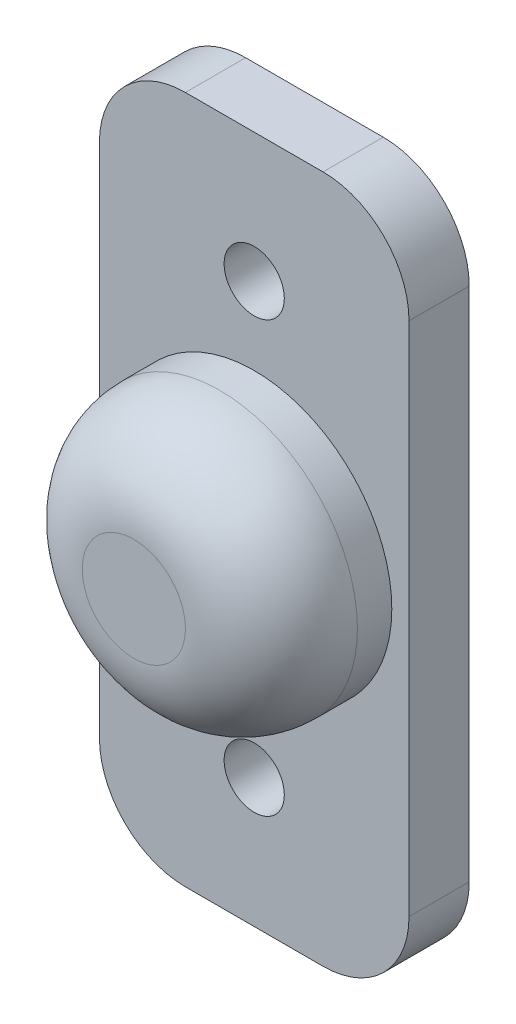
ISO-10303-21;
HEADER;
FILE_DESCRIPTION(('STEP AP214'),'2;1');
FILE_NAME('part.step','',(''),(''),'','','');
FILE_SCHEMA(('AUTOMOTIVE_DESIGN { 1 0 10303 214 1 1 1 1 }'));
ENDSEC;
DATA;
#1=APPLICATION_CONTEXT('core data for automotive mechanical design processes');
#2=APPLICATION_PROTOCOL_DEFINITION('international standard','automotive_design',2000,#1);
#3=PRODUCT_CONTEXT('',#1,'mechanical');
#4=PRODUCT('Part','Part','',(#3));
#5=PRODUCT_RELATED_PRODUCT_CATEGORY('part','',(#4));
#6=PRODUCT_DEFINITION_FORMATION('','',#4);
#7=PRODUCT_DEFINITION_CONTEXT('part definition',#1,'design');
#8=PRODUCT_DEFINITION('design','',#6,#7);
#9=PRODUCT_DEFINITION_SHAPE('','',#8);
#10=(LENGTH_UNIT() NAMED_UNIT(*) SI_UNIT(.MILLI.,.METRE.));
#11=(NAMED_UNIT(*) PLANE_ANGLE_UNIT() SI_UNIT($,.RADIAN.));
#12=(NAMED_UNIT(*) SI_UNIT($,.STERADIAN.) SOLID_ANGLE_UNIT());
#13=UNCERTAINTY_MEASURE_WITH_UNIT(LENGTH_MEASURE(1.E-05),#10,'distance_accuracy_value','');
#14=(GEOMETRIC_REPRESENTATION_CONTEXT(3) GLOBAL_UNCERTAINTY_ASSIGNED_CONTEXT((#13)) GLOBAL_UNIT_ASSIGNED_CONTEXT((#10,
#11,#12)) REPRESENTATION_CONTEXT('',''));
#15=CARTESIAN_POINT('',(0.,0.,0.));
#16=DIRECTION('',(0.,0.,1.));
#17=DIRECTION('',(1.,0.,0.));
#18=AXIS2_PLACEMENT_3D('',#15,#16,#17);
#19=CARTESIAN_POINT('',(0.,0.,3.5));
#20=DIRECTION('',(0.,0.,1.));
#21=DIRECTION('',(1.,0.,0.));
#22=AXIS2_PLACEMENT_3D('',#19,#20,#21);
#23=PLANE('',#22);
#24=CARTESIAN_POINT('',(-6.97029165718189,-3.68587589894697,3.5));
#25=DIRECTION('',(0.,0.,1.));
#26=DIRECTION('',(1.,0.,0.));
#27=AXIS2_PLACEMENT_3D('',#24,#25,#26);
#28=CIRCLE('',#27,1.75);
#29=CARTESIAN_POINT('',(-5.22029165718189,-3.68587589894697,3.5));
#30=VERTEX_POINT('',#29);
#31=EDGE_CURVE('E190',#30,#30,#28,.T.);
#32=ORIENTED_EDGE('',*,*,#31,.F.);
#33=EDGE_LOOP('',(#32));
#34=FACE_BOUND('',#33,.T.);
#35=DIRECTION('',(1.,0.,0.));
#36=VECTOR('',#35,1.);
#37=CARTESIAN_POINT('',(-15.9702916571819,-11.185875898947,3.5));
#38=LINE('',#37,#36);
#39=CARTESIAN_POINT('',(-10.9702916571819,-11.185875898947,3.5));
#40=VERTEX_POINT('',#39);
#41=CARTESIAN_POINT('',(-2.97029165718189,-11.185875898947,3.5));
#42=VERTEX_POINT('',#41);
#43=EDGE_CURVE('E176',#40,#42,#38,.T.);
#44=ORIENTED_EDGE('',*,*,#43,.T.);
#45=CARTESIAN_POINT('',(-2.97029165718189,-6.18587589894697,3.5));
#46=DIRECTION('',(0.,0.,1.));
#47=DIRECTION('',(1.,0.,0.));
#48=AXIS2_PLACEMENT_3D('',#45,#46,#47);
#49=CIRCLE('',#48,5.);
#50=CARTESIAN_POINT('',(2.02970834281811,-6.18587589894697,3.5));
#51=VERTEX_POINT('',#50);
#52=EDGE_CURVE('E154',#42,#51,#49,.T.);
#53=ORIENTED_EDGE('',*,*,#52,.T.);
#54=DIRECTION('',(0.,1.,0.));
#55=VECTOR('',#54,1.);
#56=CARTESIAN_POINT('',(2.02970834281811,28.814124101053,3.5));
#57=LINE('',#56,#55);
#58=CARTESIAN_POINT('',(2.02970834281811,23.814124101053,3.5));
#59=VERTEX_POINT('',#58);
#60=EDGE_CURVE('E118',#51,#59,#57,.T.);
#61=ORIENTED_EDGE('',*,*,#60,.T.);
#62=CARTESIAN_POINT('',(-2.97029165718189,23.814124101053,3.5));
#63=DIRECTION('',(0.,0.,1.));
#64=DIRECTION('',(1.,0.,0.));
#65=AXIS2_PLACEMENT_3D('',#62,#63,#64);
#66=CIRCLE('',#65,5.);
#67=CARTESIAN_POINT('',(-2.97029165718189,28.814124101053,3.5));
#68=VERTEX_POINT('',#67);
#69=EDGE_CURVE('E54',#59,#68,#66,.T.);
#70=ORIENTED_EDGE('',*,*,#69,.T.);
#71=DIRECTION('',(-1.,0.,0.));
#72=VECTOR('',#71,1.);
#73=CARTESIAN_POINT('',(-15.9702916571819,28.814124101053,3.5));
#74=LINE('',#73,#72);
#75=CARTESIAN_POINT('',(-10.9702916571819,28.814124101053,3.5));
#76=VERTEX_POINT('',#75);
#77=EDGE_CURVE('E138',#68,#76,#74,.T.);
#78=ORIENTED_EDGE('',*,*,#77,.T.);
#79=CARTESIAN_POINT('',(-10.9702916571819,23.814124101053,3.5));
#80=DIRECTION('',(0.,0.,1.));
#81=DIRECTION('',(1.,0.,0.));
#82=AXIS2_PLACEMENT_3D('',#79,#80,#81);
#83=CIRCLE('',#82,5.);
#84=CARTESIAN_POINT('',(-15.9702916571819,23.814124101053,3.5));
#85=VERTEX_POINT('',#84);
#86=EDGE_CURVE('E150',#76,#85,#83,.T.);
#87=ORIENTED_EDGE('',*,*,#86,.T.);
#88=DIRECTION('',(0.,-1.,0.));
#89=VECTOR('',#88,1.);
#90=CARTESIAN_POINT('',(-15.9702916571819,28.814124101053,3.5));
#91=LINE('',#90,#89);
#92=CARTESIAN_POINT('',(-15.9702916571819,-6.18587589894697,3.5));
#93=VERTEX_POINT('',#92);
#94=EDGE_CURVE('E128',#85,#93,#91,.T.);
#95=ORIENTED_EDGE('',*,*,#94,.T.);
#96=CARTESIAN_POINT('',(-10.9702916571819,-6.18587589894698,3.5));
#97=DIRECTION('',(0.,0.,1.));
#98=DIRECTION('',(1.,0.,0.));
#99=AXIS2_PLACEMENT_3D('',#96,#97,#98);
#100=CIRCLE('',#99,5.);
#101=EDGE_CURVE('E152',#93,#40,#100,.T.);
#102=ORIENTED_EDGE('',*,*,#101,.T.);
#103=EDGE_LOOP('',(#44,#53,#61,#70,#78,#87,#95,#102));
#104=FACE_BOUND('',#103,.T.);
#105=CARTESIAN_POINT('',(-6.97029165718189,21.314124101053,3.5));
#106=DIRECTION('',(0.,0.,1.));
#107=DIRECTION('',(1.,0.,0.));
#108=AXIS2_PLACEMENT_3D('',#105,#106,#107);
#109=CIRCLE('',#108,1.75);
#110=CARTESIAN_POINT('',(-5.22029165718189,21.314124101053,3.5));
#111=VERTEX_POINT('',#110);
#112=EDGE_CURVE('E185',#111,#111,#109,.T.);
#113=ORIENTED_EDGE('',*,*,#112,.F.);
#114=EDGE_LOOP('',(#113));
#115=FACE_BOUND('',#114,.T.);
#116=CARTESIAN_POINT('',(-6.9702916571819,8.81412410105303,3.5));
#117=DIRECTION('',(0.,0.,1.));
#118=DIRECTION('',(1.,0.,0.));
#119=AXIS2_PLACEMENT_3D('',#116,#117,#118);
#120=CIRCLE('',#119,8.);
#121=CARTESIAN_POINT('',(1.02970834281811,8.81412410105303,3.5));
#122=VERTEX_POINT('',#121);
#123=EDGE_CURVE('E195',#122,#122,#120,.T.);
#124=ORIENTED_EDGE('',*,*,#123,.F.);
#125=EDGE_LOOP('',(#124));
#126=FACE_BOUND('',#125,.T.);
#127=ADVANCED_FACE('F34',(#34,#104,#115,#126),#23,.T.);
#128=CARTESIAN_POINT('',(0.,0.,0.));
#129=DIRECTION('',(0.,0.,1.));
#130=DIRECTION('',(1.,0.,0.));
#131=AXIS2_PLACEMENT_3D('',#128,#129,#130);
#132=PLANE('',#131);
#133=CARTESIAN_POINT('',(-6.9702916571819,8.81412410105303,0.));
#134=DIRECTION('',(0.,0.,-1.));
#135=DIRECTION('',(-1.,0.,0.));
#136=AXIS2_PLACEMENT_3D('',#133,#134,#135);
#137=CIRCLE('',#136,5.);
#138=CARTESIAN_POINT('',(-11.9702916571819,8.81412410105303,0.));
#139=VERTEX_POINT('',#138);
#140=EDGE_CURVE('E203',#139,#139,#137,.T.);
#141=ORIENTED_EDGE('',*,*,#140,.F.);
#142=EDGE_LOOP('',(#141));
#143=FACE_BOUND('',#142,.T.);
#144=CARTESIAN_POINT('',(-6.97029165718189,21.314124101053,0.));
#145=DIRECTION('',(0.,0.,1.));
#146=DIRECTION('',(1.,0.,0.));
#147=AXIS2_PLACEMENT_3D('',#144,#145,#146);
#148=CIRCLE('',#147,1.75);
#149=CARTESIAN_POINT('',(-5.22029165718189,21.314124101053,0.));
#150=VERTEX_POINT('',#149);
#151=EDGE_CURVE('E181',#150,#150,#148,.T.);
#152=ORIENTED_EDGE('',*,*,#151,.T.);
#153=EDGE_LOOP('',(#152));
#154=FACE_BOUND('',#153,.T.);
#155=DIRECTION('',(0.,1.,0.));
#156=VECTOR('',#155,1.);
#157=CARTESIAN_POINT('',(2.02970834281811,28.814124101053,0.));
#158=LINE('',#157,#156);
#159=CARTESIAN_POINT('',(2.02970834281811,-6.18587589894697,0.));
#160=VERTEX_POINT('',#159);
#161=CARTESIAN_POINT('',(2.02970834281811,23.814124101053,0.));
#162=VERTEX_POINT('',#161);
#163=EDGE_CURVE('E116',#160,#162,#158,.T.);
#164=ORIENTED_EDGE('',*,*,#163,.F.);
#165=CARTESIAN_POINT('',(-2.97029165718189,-6.18587589894697,0.));
#166=DIRECTION('',(0.,0.,1.));
#167=DIRECTION('',(1.,0.,0.));
#168=AXIS2_PLACEMENT_3D('',#165,#166,#167);
#169=CIRCLE('',#168,5.);
#170=CARTESIAN_POINT('',(-2.97029165718189,-11.185875898947,0.));
#171=VERTEX_POINT('',#170);
#172=EDGE_CURVE('E99',#160,#171,#169,.F.);
#173=ORIENTED_EDGE('',*,*,#172,.T.);
#174=DIRECTION('',(1.,0.,0.));
#175=VECTOR('',#174,1.);
#176=CARTESIAN_POINT('',(-15.9702916571819,-11.185875898947,0.));
#177=LINE('',#176,#175);
#178=CARTESIAN_POINT('',(-10.9702916571819,-11.185875898947,0.));
#179=VERTEX_POINT('',#178);
#180=EDGE_CURVE('E126',#179,#171,#177,.T.);
#181=ORIENTED_EDGE('',*,*,#180,.F.);
#182=CARTESIAN_POINT('',(-10.9702916571819,-6.18587589894698,0.));
#183=DIRECTION('',(0.,0.,1.));
#184=DIRECTION('',(1.,0.,0.));
#185=AXIS2_PLACEMENT_3D('',#182,#183,#184);
#186=CIRCLE('',#185,5.);
#187=CARTESIAN_POINT('',(-15.9702916571819,-6.18587589894697,0.));
#188=VERTEX_POINT('',#187);
#189=EDGE_CURVE('E110',#179,#188,#186,.F.);
#190=ORIENTED_EDGE('',*,*,#189,.T.);
#191=DIRECTION('',(0.,-1.,0.));
#192=VECTOR('',#191,1.);
#193=CARTESIAN_POINT('',(-15.9702916571819,28.814124101053,0.));
#194=LINE('',#193,#192);
#195=CARTESIAN_POINT('',(-15.9702916571819,23.814124101053,0.));
#196=VERTEX_POINT('',#195);
#197=EDGE_CURVE('E130',#196,#188,#194,.T.);
#198=ORIENTED_EDGE('',*,*,#197,.F.);
#199=CARTESIAN_POINT('',(-10.9702916571819,23.814124101053,0.));
#200=DIRECTION('',(0.,0.,1.));
#201=DIRECTION('',(1.,0.,0.));
#202=AXIS2_PLACEMENT_3D('',#199,#200,#201);
#203=CIRCLE('',#202,5.);
#204=CARTESIAN_POINT('',(-10.9702916571819,28.814124101053,0.));
#205=VERTEX_POINT('',#204);
#206=EDGE_CURVE('E143',#196,#205,#203,.F.);
#207=ORIENTED_EDGE('',*,*,#206,.T.);
#208=DIRECTION('',(-1.,0.,0.));
#209=VECTOR('',#208,1.);
#210=CARTESIAN_POINT('',(-15.9702916571819,28.814124101053,0.));
#211=LINE('',#210,#209);
#212=CARTESIAN_POINT('',(-2.97029165718189,28.814124101053,0.));
#213=VERTEX_POINT('',#212);
#214=EDGE_CURVE('E125',#213,#205,#211,.T.);
#215=ORIENTED_EDGE('',*,*,#214,.F.);
#216=CARTESIAN_POINT('',(-2.97029165718189,23.814124101053,0.));
#217=DIRECTION('',(0.,0.,1.));
#218=DIRECTION('',(1.,0.,0.));
#219=AXIS2_PLACEMENT_3D('',#216,#217,#218);
#220=CIRCLE('',#219,5.);
#221=EDGE_CURVE('E119',#213,#162,#220,.F.);
#222=ORIENTED_EDGE('',*,*,#221,.T.);
#223=EDGE_LOOP('',(#164,#173,#181,#190,#198,#207,#215,#222));
#224=FACE_BOUND('',#223,.T.);
#225=CARTESIAN_POINT('',(-6.97029165718189,-3.68587589894697,0.));
#226=DIRECTION('',(0.,0.,1.));
#227=DIRECTION('',(1.,0.,0.));
#228=AXIS2_PLACEMENT_3D('',#225,#226,#227);
#229=CIRCLE('',#228,1.75);
#230=CARTESIAN_POINT('',(-5.22029165718189,-3.68587589894697,0.));
#231=VERTEX_POINT('',#230);
#232=EDGE_CURVE('E192',#231,#231,#229,.T.);
#233=ORIENTED_EDGE('',*,*,#232,.T.);
#234=EDGE_LOOP('',(#233));
#235=FACE_BOUND('',#234,.T.);
#236=ADVANCED_FACE('F122',(#143,#154,#224,#235),#132,.F.);
#237=CARTESIAN_POINT('',(-15.9702916571819,28.814124101053,3.5));
#238=DIRECTION('',(1.,0.,0.));
#239=DIRECTION('',(0.,1.,0.));
#240=AXIS2_PLACEMENT_3D('',#237,#238,#239);
#241=PLANE('',#240);
#242=ORIENTED_EDGE('',*,*,#197,.T.);
#243=DIRECTION('',(0.,0.,-1.));
#244=VECTOR('',#243,1.);
#245=CARTESIAN_POINT('',(-15.9702916571819,-6.18587589894697,3.5));
#246=LINE('',#245,#244);
#247=EDGE_CURVE('E159',#188,#93,#246,.F.);
#248=ORIENTED_EDGE('',*,*,#247,.T.);
#249=ORIENTED_EDGE('',*,*,#94,.F.);
#250=DIRECTION('',(0.,0.,-1.));
#251=VECTOR('',#250,1.);
#252=CARTESIAN_POINT('',(-15.9702916571819,23.814124101053,3.5));
#253=LINE('',#252,#251);
#254=EDGE_CURVE('E156',#85,#196,#253,.T.);
#255=ORIENTED_EDGE('',*,*,#254,.T.);
#256=EDGE_LOOP('',(#242,#248,#249,#255));
#257=FACE_BOUND('',#256,.T.);
#258=ADVANCED_FACE('F172',(#257),#241,.F.);
#259=CARTESIAN_POINT('',(-15.9702916571819,-11.185875898947,3.5));
#260=DIRECTION('',(0.,1.,0.));
#261=DIRECTION('',(-1.,0.,0.));
#262=AXIS2_PLACEMENT_3D('',#259,#260,#261);
#263=PLANE('',#262);
#264=ORIENTED_EDGE('',*,*,#180,.T.);
#265=DIRECTION('',(0.,0.,-1.));
#266=VECTOR('',#265,1.);
#267=CARTESIAN_POINT('',(-2.97029165718189,-11.185875898947,3.5));
#268=LINE('',#267,#266);
#269=EDGE_CURVE('E104',#171,#42,#268,.F.);
#270=ORIENTED_EDGE('',*,*,#269,.T.);
#271=ORIENTED_EDGE('',*,*,#43,.F.);
#272=DIRECTION('',(0.,0.,-1.));
#273=VECTOR('',#272,1.);
#274=CARTESIAN_POINT('',(-10.9702916571819,-11.185875898947,3.5));
#275=LINE('',#274,#273);
#276=EDGE_CURVE('E109',#40,#179,#275,.T.);
#277=ORIENTED_EDGE('',*,*,#276,.T.);
#278=EDGE_LOOP('',(#264,#270,#271,#277));
#279=FACE_BOUND('',#278,.T.);
#280=ADVANCED_FACE('F236',(#279),#263,.F.);
#281=CARTESIAN_POINT('',(2.02970834281811,28.814124101053,3.5));
#282=DIRECTION('',(-1.,0.,0.));
#283=DIRECTION('',(0.,-1.,0.));
#284=AXIS2_PLACEMENT_3D('',#281,#282,#283);
#285=PLANE('',#284);
#286=ORIENTED_EDGE('',*,*,#60,.F.);
#287=DIRECTION('',(0.,0.,-1.));
#288=VECTOR('',#287,1.);
#289=CARTESIAN_POINT('',(2.02970834281811,-6.18587589894697,3.5));
#290=LINE('',#289,#288);
#291=EDGE_CURVE('E103',#51,#160,#290,.T.);
#292=ORIENTED_EDGE('',*,*,#291,.T.);
#293=ORIENTED_EDGE('',*,*,#163,.T.);
#294=DIRECTION('',(0.,0.,-1.));
#295=VECTOR('',#294,1.);
#296=CARTESIAN_POINT('',(2.02970834281811,23.814124101053,3.5));
#297=LINE('',#296,#295);
#298=EDGE_CURVE('E120',#162,#59,#297,.F.);
#299=ORIENTED_EDGE('',*,*,#298,.T.);
#300=EDGE_LOOP('',(#286,#292,#293,#299));
#301=FACE_BOUND('',#300,.T.);
#302=ADVANCED_FACE('F115',(#301),#285,.F.);
#303=CARTESIAN_POINT('',(-15.9702916571819,28.814124101053,3.5));
#304=DIRECTION('',(0.,-1.,0.));
#305=DIRECTION('',(1.,0.,0.));
#306=AXIS2_PLACEMENT_3D('',#303,#304,#305);
#307=PLANE('',#306);
#308=ORIENTED_EDGE('',*,*,#214,.T.);
#309=DIRECTION('',(0.,0.,-1.));
#310=VECTOR('',#309,1.);
#311=CARTESIAN_POINT('',(-10.9702916571819,28.814124101053,3.5));
#312=LINE('',#311,#310);
#313=EDGE_CURVE('E12',#205,#76,#312,.F.);
#314=ORIENTED_EDGE('',*,*,#313,.T.);
#315=ORIENTED_EDGE('',*,*,#77,.F.);
#316=DIRECTION('',(0.,0.,-1.));
#317=VECTOR('',#316,1.);
#318=CARTESIAN_POINT('',(-2.97029165718189,28.814124101053,3.5));
#319=LINE('',#318,#317);
#320=EDGE_CURVE('E42',#68,#213,#319,.T.);
#321=ORIENTED_EDGE('',*,*,#320,.T.);
#322=EDGE_LOOP('',(#308,#314,#315,#321));
#323=FACE_BOUND('',#322,.T.);
#324=ADVANCED_FACE('F162',(#323),#307,.F.);
#325=CARTESIAN_POINT('',(-6.97029165718189,21.314124101053,3.5));
#326=DIRECTION('',(0.,0.,-1.));
#327=DIRECTION('',(-1.,0.,0.));
#328=AXIS2_PLACEMENT_3D('',#325,#326,#327);
#329=CYLINDRICAL_SURFACE('',#328,1.75);
#330=ORIENTED_EDGE('',*,*,#112,.T.);
#331=EDGE_LOOP('',(#330));
#332=FACE_BOUND('',#331,.T.);
#333=ORIENTED_EDGE('',*,*,#151,.F.);
#334=EDGE_LOOP('',(#333));
#335=FACE_BOUND('',#334,.T.);
#336=ADVANCED_FACE('F215',(#332,#335),#329,.F.);
#337=CARTESIAN_POINT('',(-6.97029165718189,-3.68587589894697,3.5));
#338=DIRECTION('',(0.,0.,-1.));
#339=DIRECTION('',(-1.,0.,0.));
#340=AXIS2_PLACEMENT_3D('',#337,#338,#339);
#341=CYLINDRICAL_SURFACE('',#340,1.75);
#342=ORIENTED_EDGE('',*,*,#31,.T.);
#343=EDGE_LOOP('',(#342));
#344=FACE_BOUND('',#343,.T.);
#345=ORIENTED_EDGE('',*,*,#232,.F.);
#346=EDGE_LOOP('',(#345));
#347=FACE_BOUND('',#346,.T.);
#348=ADVANCED_FACE('F217',(#344,#347),#341,.F.);
#349=CARTESIAN_POINT('',(-6.9702916571819,8.81412410105303,10.5));
#350=DIRECTION('',(0.,0.,-1.));
#351=DIRECTION('',(-1.,0.,0.));
#352=AXIS2_PLACEMENT_3D('',#349,#350,#351);
#353=CYLINDRICAL_SURFACE('',#352,8.);
#354=CARTESIAN_POINT('',(-6.9702916571819,8.81412410105303,5.5));
#355=DIRECTION('',(0.,0.,1.));
#356=DIRECTION('',(1.,0.,0.));
#357=AXIS2_PLACEMENT_3D('',#354,#355,#356);
#358=CIRCLE('',#357,8.);
#359=CARTESIAN_POINT('',(1.02970834281811,8.81412410105303,5.5));
#360=VERTEX_POINT('',#359);
#361=EDGE_CURVE('E137',#360,#360,#358,.F.);
#362=ORIENTED_EDGE('',*,*,#361,.T.);
#363=EDGE_LOOP('',(#362));
#364=FACE_BOUND('',#363,.T.);
#365=ORIENTED_EDGE('',*,*,#123,.T.);
#366=EDGE_LOOP('',(#365));
#367=FACE_BOUND('',#366,.T.);
#368=ADVANCED_FACE('F223',(#364,#367),#353,.T.);
#369=CARTESIAN_POINT('',(-6.9702916571819,8.81412410105303,10.5));
#370=DIRECTION('',(0.,0.,1.));
#371=DIRECTION('',(1.,0.,0.));
#372=AXIS2_PLACEMENT_3D('',#369,#370,#371);
#373=PLANE('',#372);
#374=CARTESIAN_POINT('',(-6.9702916571819,8.81412410105303,10.5));
#375=DIRECTION('',(0.,0.,1.));
#376=DIRECTION('',(1.,0.,0.));
#377=AXIS2_PLACEMENT_3D('',#374,#375,#376);
#378=CIRCLE('',#377,3.);
#379=CARTESIAN_POINT('',(-3.97029165718189,8.81412410105303,10.5));
#380=VERTEX_POINT('',#379);
#381=EDGE_CURVE('E134',#380,#380,#378,.T.);
#382=ORIENTED_EDGE('',*,*,#381,.T.);
#383=EDGE_LOOP('',(#382));
#384=FACE_BOUND('',#383,.T.);
#385=ADVANCED_FACE('F264',(#384),#373,.T.);
#386=CARTESIAN_POINT('',(-6.9702916571819,8.81412410105303,6.5));
#387=DIRECTION('',(0.,0.,1.));
#388=DIRECTION('',(1.,0.,0.));
#389=AXIS2_PLACEMENT_3D('',#386,#387,#388);
#390=PLANE('',#389);
#391=CARTESIAN_POINT('',(-6.9702916571819,8.81412410105303,6.5));
#392=DIRECTION('',(0.,0.,1.));
#393=DIRECTION('',(1.,0.,0.));
#394=AXIS2_PLACEMENT_3D('',#391,#392,#393);
#395=CIRCLE('',#394,5.);
#396=CARTESIAN_POINT('',(-1.97029165718189,8.81412410105303,6.5));
#397=VERTEX_POINT('',#396);
#398=EDGE_CURVE('E200',#397,#397,#395,.F.);
#399=ORIENTED_EDGE('',*,*,#398,.T.);
#400=EDGE_LOOP('',(#399));
#401=FACE_BOUND('',#400,.T.);
#402=ADVANCED_FACE('F270',(#401),#390,.F.);
#403=CARTESIAN_POINT('',(-6.9702916571819,8.81412410105303,24.642135623731));
#404=DIRECTION('',(0.,0.,-1.));
#405=DIRECTION('',(-1.,0.,0.));
#406=AXIS2_PLACEMENT_3D('',#403,#404,#405);
#407=CYLINDRICAL_SURFACE('',#406,5.);
#408=ORIENTED_EDGE('',*,*,#140,.T.);
#409=EDGE_LOOP('',(#408));
#410=FACE_BOUND('',#409,.T.);
#411=ORIENTED_EDGE('',*,*,#398,.F.);
#412=EDGE_LOOP('',(#411));
#413=FACE_BOUND('',#412,.T.);
#414=ADVANCED_FACE('F207',(#410,#413),#407,.F.);
#415=CARTESIAN_POINT('',(-6.9702916571819,8.81412410105303,5.5));
#416=DIRECTION('',(0.,0.,1.));
#417=DIRECTION('',(1.,0.,0.));
#418=AXIS2_PLACEMENT_3D('',#415,#416,#417);
#419=DEGENERATE_TOROIDAL_SURFACE('',#418,3.,5.,.T.);
#420=ORIENTED_EDGE('',*,*,#361,.F.);
#421=EDGE_LOOP('',(#420));
#422=FACE_BOUND('',#421,.T.);
#423=ORIENTED_EDGE('',*,*,#381,.F.);
#424=EDGE_LOOP('',(#423));
#425=FACE_BOUND('',#424,.T.);
#426=ADVANCED_FACE('F242',(#422,#425),#419,.T.);
#427=CARTESIAN_POINT('',(-2.97029165718189,-6.18587589894697,3.5));
#428=DIRECTION('',(0.,0.,-1.));
#429=DIRECTION('',(-1.,0.,0.));
#430=AXIS2_PLACEMENT_3D('',#427,#428,#429);
#431=CYLINDRICAL_SURFACE('',#430,5.);
#432=ORIENTED_EDGE('',*,*,#52,.F.);
#433=ORIENTED_EDGE('',*,*,#269,.F.);
#434=ORIENTED_EDGE('',*,*,#172,.F.);
#435=ORIENTED_EDGE('',*,*,#291,.F.);
#436=EDGE_LOOP('',(#432,#433,#434,#435));
#437=FACE_BOUND('',#436,.T.);
#438=ADVANCED_FACE('F102',(#437),#431,.T.);
#439=CARTESIAN_POINT('',(-10.9702916571819,-6.18587589894698,3.5));
#440=DIRECTION('',(0.,0.,-1.));
#441=DIRECTION('',(-1.,0.,0.));
#442=AXIS2_PLACEMENT_3D('',#439,#440,#441);
#443=CYLINDRICAL_SURFACE('',#442,5.);
#444=ORIENTED_EDGE('',*,*,#101,.F.);
#445=ORIENTED_EDGE('',*,*,#247,.F.);
#446=ORIENTED_EDGE('',*,*,#189,.F.);
#447=ORIENTED_EDGE('',*,*,#276,.F.);
#448=EDGE_LOOP('',(#444,#445,#446,#447));
#449=FACE_BOUND('',#448,.T.);
#450=ADVANCED_FACE('F248',(#449),#443,.T.);
#451=CARTESIAN_POINT('',(-10.9702916571819,23.814124101053,3.5));
#452=DIRECTION('',(0.,0.,-1.));
#453=DIRECTION('',(-1.,0.,0.));
#454=AXIS2_PLACEMENT_3D('',#451,#452,#453);
#455=CYLINDRICAL_SURFACE('',#454,5.);
#456=ORIENTED_EDGE('',*,*,#86,.F.);
#457=ORIENTED_EDGE('',*,*,#313,.F.);
#458=ORIENTED_EDGE('',*,*,#206,.F.);
#459=ORIENTED_EDGE('',*,*,#254,.F.);
#460=EDGE_LOOP('',(#456,#457,#458,#459));
#461=FACE_BOUND('',#460,.T.);
#462=ADVANCED_FACE('F169',(#461),#455,.T.);
#463=CARTESIAN_POINT('',(-2.97029165718189,23.814124101053,3.5));
#464=DIRECTION('',(0.,0.,-1.));
#465=DIRECTION('',(-1.,0.,0.));
#466=AXIS2_PLACEMENT_3D('',#463,#464,#465);
#467=CYLINDRICAL_SURFACE('',#466,5.);
#468=ORIENTED_EDGE('',*,*,#69,.F.);
#469=ORIENTED_EDGE('',*,*,#298,.F.);
#470=ORIENTED_EDGE('',*,*,#221,.F.);
#471=ORIENTED_EDGE('',*,*,#320,.F.);
#472=EDGE_LOOP('',(#468,#469,#470,#471));
#473=FACE_BOUND('',#472,.T.);
#474=ADVANCED_FACE('F36',(#473),#467,.T.);
#475=CLOSED_SHELL('',(#127,#236,#258,#280,#302,#324,#336,#348,#368,#385,#402,#414,#426,#438,
#450,#462,#474));
#476=MANIFOLD_SOLID_BREP('B2',#475);
#477=ADVANCED_BREP_SHAPE_REPRESENTATION('',(#18,#476),#14);
#478=SHAPE_DEFINITION_REPRESENTATION(#9,#477);
ENDSEC;
END-ISO-10303-21;
